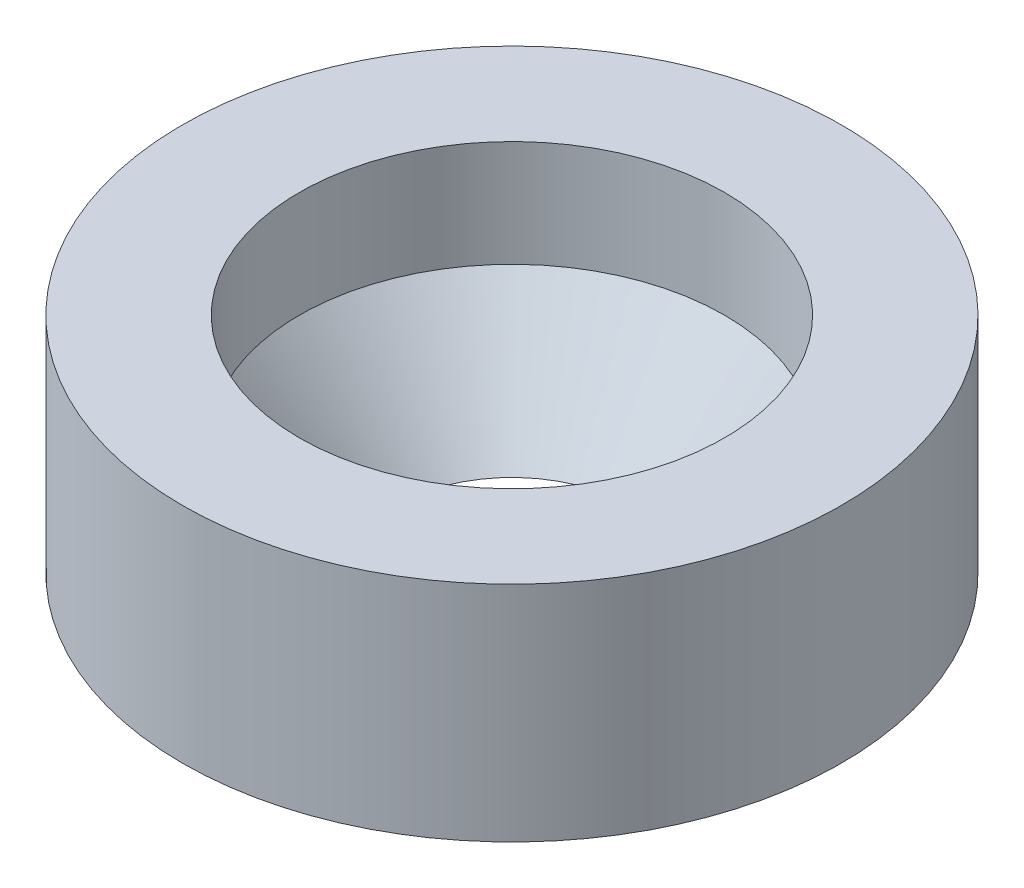
ISO-10303-21;
HEADER;
FILE_DESCRIPTION(('STEP AP214'),'2;1');
FILE_NAME('part.step','',(''),(''),'','','');
FILE_SCHEMA(('AUTOMOTIVE_DESIGN { 1 0 10303 214 1 1 1 1 }'));
ENDSEC;
DATA;
#1=APPLICATION_CONTEXT('core data for automotive mechanical design processes');
#2=APPLICATION_PROTOCOL_DEFINITION('international standard','automotive_design',2000,#1);
#3=PRODUCT_CONTEXT('',#1,'mechanical');
#4=PRODUCT('Part','Part','',(#3));
#5=PRODUCT_RELATED_PRODUCT_CATEGORY('part','',(#4));
#6=PRODUCT_DEFINITION_FORMATION('','',#4);
#7=PRODUCT_DEFINITION_CONTEXT('part definition',#1,'design');
#8=PRODUCT_DEFINITION('design','',#6,#7);
#9=PRODUCT_DEFINITION_SHAPE('','',#8);
#10=(LENGTH_UNIT() NAMED_UNIT(*) SI_UNIT(.MILLI.,.METRE.));
#11=(NAMED_UNIT(*) PLANE_ANGLE_UNIT() SI_UNIT($,.RADIAN.));
#12=(NAMED_UNIT(*) SI_UNIT($,.STERADIAN.) SOLID_ANGLE_UNIT());
#13=UNCERTAINTY_MEASURE_WITH_UNIT(LENGTH_MEASURE(1.E-05),#10,'distance_accuracy_value','');
#14=(GEOMETRIC_REPRESENTATION_CONTEXT(3) GLOBAL_UNCERTAINTY_ASSIGNED_CONTEXT((#13)) GLOBAL_UNIT_ASSIGNED_CONTEXT((#10,
#11,#12)) REPRESENTATION_CONTEXT('',''));
#15=CARTESIAN_POINT('',(0.,0.,0.));
#16=DIRECTION('',(0.,0.,1.));
#17=DIRECTION('',(1.,0.,0.));
#18=AXIS2_PLACEMENT_3D('',#15,#16,#17);
#19=CARTESIAN_POINT('',(0.,2.2,0.));
#20=DIRECTION('',(0.,1.,0.));
#21=DIRECTION('',(0.,0.,1.));
#22=AXIS2_PLACEMENT_3D('',#19,#20,#21);
#23=CYLINDRICAL_SURFACE('',#22,4.);
#24=CARTESIAN_POINT('',(0.,4.2,0.));
#25=DIRECTION('',(0.,1.,0.));
#26=DIRECTION('',(0.,0.,1.));
#27=AXIS2_PLACEMENT_3D('',#24,#25,#26);
#28=CIRCLE('',#27,4.);
#29=CARTESIAN_POINT('',(0.,4.2,4.));
#30=VERTEX_POINT('',#29);
#31=EDGE_CURVE('E54',#30,#30,#28,.T.);
#32=ORIENTED_EDGE('',*,*,#31,.T.);
#33=EDGE_LOOP('',(#32));
#34=FACE_BOUND('',#33,.T.);
#35=CARTESIAN_POINT('',(0.,2.2,0.));
#36=DIRECTION('',(0.,1.,0.));
#37=DIRECTION('',(0.,0.,1.));
#38=AXIS2_PLACEMENT_3D('',#35,#36,#37);
#39=CIRCLE('',#38,4.);
#40=CARTESIAN_POINT('',(0.,2.2,4.));
#41=VERTEX_POINT('',#40);
#42=EDGE_CURVE('E10',#41,#41,#39,.T.);
#43=ORIENTED_EDGE('',*,*,#42,.F.);
#44=EDGE_LOOP('',(#43));
#45=FACE_BOUND('',#44,.T.);
#46=ADVANCED_FACE('F35',(#34,#45),#23,.F.);
#47=CARTESIAN_POINT('',(0.,2.2,0.));
#48=DIRECTION('',(0.,1.,0.));
#49=DIRECTION('',(0.,0.,1.));
#50=AXIS2_PLACEMENT_3D('',#47,#48,#49);
#51=CONICAL_SURFACE('',#50,4.,0.685729510906286);
#52=CARTESIAN_POINT('',(0.,0.,0.));
#53=DIRECTION('',(0.,1.,0.));
#54=DIRECTION('',(0.,0.,1.));
#55=AXIS2_PLACEMENT_3D('',#52,#53,#54);
#56=CIRCLE('',#55,2.2);
#57=CARTESIAN_POINT('',(0.,0.,2.2));
#58=VERTEX_POINT('',#57);
#59=EDGE_CURVE('E41',#58,#58,#56,.T.);
#60=ORIENTED_EDGE('',*,*,#59,.F.);
#61=EDGE_LOOP('',(#60));
#62=FACE_BOUND('',#61,.T.);
#63=ORIENTED_EDGE('',*,*,#42,.T.);
#64=EDGE_LOOP('',(#63));
#65=FACE_BOUND('',#64,.T.);
#66=ADVANCED_FACE('F72',(#62,#65),#51,.F.);
#67=CARTESIAN_POINT('',(0.,0.,0.));
#68=DIRECTION('',(0.,1.,0.));
#69=DIRECTION('',(0.,0.,1.));
#70=AXIS2_PLACEMENT_3D('',#67,#68,#69);
#71=PLANE('',#70);
#72=CARTESIAN_POINT('',(0.,0.,0.));
#73=DIRECTION('',(0.,1.,0.));
#74=DIRECTION('',(0.,0.,1.));
#75=AXIS2_PLACEMENT_3D('',#72,#73,#74);
#76=CIRCLE('',#75,6.2);
#77=CARTESIAN_POINT('',(0.,0.,6.2));
#78=VERTEX_POINT('',#77);
#79=EDGE_CURVE('E45',#78,#78,#76,.T.);
#80=ORIENTED_EDGE('',*,*,#79,.F.);
#81=EDGE_LOOP('',(#80));
#82=FACE_BOUND('',#81,.T.);
#83=ORIENTED_EDGE('',*,*,#59,.T.);
#84=EDGE_LOOP('',(#83));
#85=FACE_BOUND('',#84,.T.);
#86=ADVANCED_FACE('F68',(#82,#85),#71,.F.);
#87=CARTESIAN_POINT('',(0.,2.2,0.));
#88=DIRECTION('',(0.,1.,0.));
#89=DIRECTION('',(0.,0.,1.));
#90=AXIS2_PLACEMENT_3D('',#87,#88,#89);
#91=CYLINDRICAL_SURFACE('',#90,6.2);
#92=CARTESIAN_POINT('',(0.,4.2,0.));
#93=DIRECTION('',(0.,1.,0.));
#94=DIRECTION('',(0.,0.,1.));
#95=AXIS2_PLACEMENT_3D('',#92,#93,#94);
#96=CIRCLE('',#95,6.2);
#97=CARTESIAN_POINT('',(0.,4.2,6.2));
#98=VERTEX_POINT('',#97);
#99=EDGE_CURVE('E49',#98,#98,#96,.T.);
#100=ORIENTED_EDGE('',*,*,#99,.F.);
#101=EDGE_LOOP('',(#100));
#102=FACE_BOUND('',#101,.T.);
#103=ORIENTED_EDGE('',*,*,#79,.T.);
#104=EDGE_LOOP('',(#103));
#105=FACE_BOUND('',#104,.T.);
#106=ADVANCED_FACE('F62',(#102,#105),#91,.T.);
#107=CARTESIAN_POINT('',(0.,4.2,0.));
#108=DIRECTION('',(0.,1.,0.));
#109=DIRECTION('',(0.,0.,1.));
#110=AXIS2_PLACEMENT_3D('',#107,#108,#109);
#111=PLANE('',#110);
#112=ORIENTED_EDGE('',*,*,#99,.T.);
#113=EDGE_LOOP('',(#112));
#114=FACE_BOUND('',#113,.T.);
#115=ORIENTED_EDGE('',*,*,#31,.F.);
#116=EDGE_LOOP('',(#115));
#117=FACE_BOUND('',#116,.T.);
#118=ADVANCED_FACE('F60',(#114,#117),#111,.T.);
#119=CLOSED_SHELL('',(#46,#66,#86,#106,#118));
#120=MANIFOLD_SOLID_BREP('B2',#119);
#121=ADVANCED_BREP_SHAPE_REPRESENTATION('',(#18,#120),#14);
#122=SHAPE_DEFINITION_REPRESENTATION(#9,#121);
ENDSEC;
END-ISO-10303-21;
